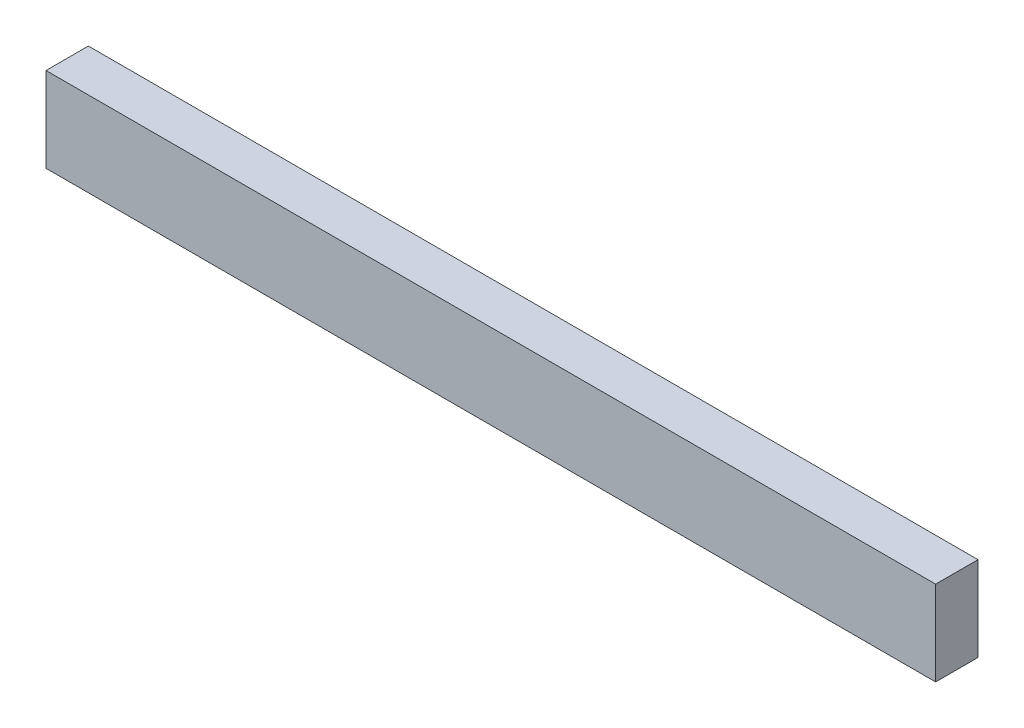
ISO-10303-21;
HEADER;
FILE_DESCRIPTION(('STEP AP214'),'2;1');
FILE_NAME('part.step','',(''),(''),'','','');
FILE_SCHEMA(('AUTOMOTIVE_DESIGN { 1 0 10303 214 1 1 1 1 }'));
ENDSEC;
DATA;
#1=APPLICATION_CONTEXT('core data for automotive mechanical design processes');
#2=APPLICATION_PROTOCOL_DEFINITION('international standard','automotive_design',2000,#1);
#3=PRODUCT_CONTEXT('',#1,'mechanical');
#4=PRODUCT('Part','Part','',(#3));
#5=PRODUCT_RELATED_PRODUCT_CATEGORY('part','',(#4));
#6=PRODUCT_DEFINITION_FORMATION('','',#4);
#7=PRODUCT_DEFINITION_CONTEXT('part definition',#1,'design');
#8=PRODUCT_DEFINITION('design','',#6,#7);
#9=PRODUCT_DEFINITION_SHAPE('','',#8);
#10=(LENGTH_UNIT() NAMED_UNIT(*) SI_UNIT(.MILLI.,.METRE.));
#11=(NAMED_UNIT(*) PLANE_ANGLE_UNIT() SI_UNIT($,.RADIAN.));
#12=(NAMED_UNIT(*) SI_UNIT($,.STERADIAN.) SOLID_ANGLE_UNIT());
#13=UNCERTAINTY_MEASURE_WITH_UNIT(LENGTH_MEASURE(1.E-05),#10,'distance_accuracy_value','');
#14=(GEOMETRIC_REPRESENTATION_CONTEXT(3) GLOBAL_UNCERTAINTY_ASSIGNED_CONTEXT((#13)) GLOBAL_UNIT_ASSIGNED_CONTEXT((#10,
#11,#12)) REPRESENTATION_CONTEXT('',''));
#15=CARTESIAN_POINT('',(0.,0.,0.));
#16=DIRECTION('',(0.,0.,1.));
#17=DIRECTION('',(1.,0.,0.));
#18=AXIS2_PLACEMENT_3D('',#15,#16,#17);
#19=CARTESIAN_POINT('',(105.,5.,2.5));
#20=DIRECTION('',(0.,0.,-1.));
#21=DIRECTION('',(0.,1.,0.));
#22=AXIS2_PLACEMENT_3D('',#19,#20,#21);
#23=PLANE('',#22);
#24=DIRECTION('',(0.,-1.,0.));
#25=VECTOR('',#24,1.);
#26=CARTESIAN_POINT('',(0.,5.,2.5));
#27=LINE('',#26,#25);
#28=CARTESIAN_POINT('',(0.,5.,2.5));
#29=VERTEX_POINT('',#28);
#30=CARTESIAN_POINT('',(0.,-5.,2.5));
#31=VERTEX_POINT('',#30);
#32=EDGE_CURVE('E111',#29,#31,#27,.T.);
#33=ORIENTED_EDGE('',*,*,#32,.T.);
#34=DIRECTION('',(-1.,0.,0.));
#35=VECTOR('',#34,1.);
#36=CARTESIAN_POINT('',(105.,-5.,2.5));
#37=LINE('',#36,#35);
#38=CARTESIAN_POINT('',(105.,-5.,2.5));
#39=VERTEX_POINT('',#38);
#40=EDGE_CURVE('E11',#39,#31,#37,.T.);
#41=ORIENTED_EDGE('',*,*,#40,.F.);
#42=DIRECTION('',(0.,-1.,0.));
#43=VECTOR('',#42,1.);
#44=CARTESIAN_POINT('',(105.,5.,2.5));
#45=LINE('',#44,#43);
#46=CARTESIAN_POINT('',(105.,5.,2.5));
#47=VERTEX_POINT('',#46);
#48=EDGE_CURVE('E95',#47,#39,#45,.T.);
#49=ORIENTED_EDGE('',*,*,#48,.F.);
#50=DIRECTION('',(-1.,0.,0.));
#51=VECTOR('',#50,1.);
#52=CARTESIAN_POINT('',(105.,5.,2.5));
#53=LINE('',#52,#51);
#54=EDGE_CURVE('E107',#47,#29,#53,.T.);
#55=ORIENTED_EDGE('',*,*,#54,.T.);
#56=EDGE_LOOP('',(#33,#41,#49,#55));
#57=FACE_BOUND('',#56,.T.);
#58=ADVANCED_FACE('F43',(#57),#23,.F.);
#59=CARTESIAN_POINT('',(105.,-5.,-2.5));
#60=DIRECTION('',(0.,1.,0.));
#61=DIRECTION('',(0.,0.,1.));
#62=AXIS2_PLACEMENT_3D('',#59,#60,#61);
#63=PLANE('',#62);
#64=DIRECTION('',(0.,0.,-1.));
#65=VECTOR('',#64,1.);
#66=CARTESIAN_POINT('',(0.,-5.,-2.5));
#67=LINE('',#66,#65);
#68=CARTESIAN_POINT('',(0.,-5.,-2.5));
#69=VERTEX_POINT('',#68);
#70=EDGE_CURVE('E100',#31,#69,#67,.T.);
#71=ORIENTED_EDGE('',*,*,#70,.T.);
#72=DIRECTION('',(-1.,0.,0.));
#73=VECTOR('',#72,1.);
#74=CARTESIAN_POINT('',(105.,-5.,-2.5));
#75=LINE('',#74,#73);
#76=CARTESIAN_POINT('',(105.,-5.,-2.5));
#77=VERTEX_POINT('',#76);
#78=EDGE_CURVE('E52',#77,#69,#75,.T.);
#79=ORIENTED_EDGE('',*,*,#78,.F.);
#80=DIRECTION('',(0.,0.,-1.));
#81=VECTOR('',#80,1.);
#82=CARTESIAN_POINT('',(105.,-5.,-2.5));
#83=LINE('',#82,#81);
#84=EDGE_CURVE('E90',#39,#77,#83,.T.);
#85=ORIENTED_EDGE('',*,*,#84,.F.);
#86=ORIENTED_EDGE('',*,*,#40,.T.);
#87=EDGE_LOOP('',(#71,#79,#85,#86));
#88=FACE_BOUND('',#87,.T.);
#89=ADVANCED_FACE('F99',(#88),#63,.F.);
#90=CARTESIAN_POINT('',(105.,5.,-2.5));
#91=DIRECTION('',(0.,0.,1.));
#92=DIRECTION('',(0.,-1.,0.));
#93=AXIS2_PLACEMENT_3D('',#90,#91,#92);
#94=PLANE('',#93);
#95=DIRECTION('',(0.,1.,0.));
#96=VECTOR('',#95,1.);
#97=CARTESIAN_POINT('',(0.,5.,-2.5));
#98=LINE('',#97,#96);
#99=CARTESIAN_POINT('',(0.,5.,-2.5));
#100=VERTEX_POINT('',#99);
#101=EDGE_CURVE('E77',#69,#100,#98,.T.);
#102=ORIENTED_EDGE('',*,*,#101,.T.);
#103=DIRECTION('',(-1.,0.,0.));
#104=VECTOR('',#103,1.);
#105=CARTESIAN_POINT('',(105.,5.,-2.5));
#106=LINE('',#105,#104);
#107=CARTESIAN_POINT('',(105.,5.,-2.5));
#108=VERTEX_POINT('',#107);
#109=EDGE_CURVE('E102',#108,#100,#106,.T.);
#110=ORIENTED_EDGE('',*,*,#109,.F.);
#111=DIRECTION('',(0.,1.,0.));
#112=VECTOR('',#111,1.);
#113=CARTESIAN_POINT('',(105.,5.,-2.5));
#114=LINE('',#113,#112);
#115=EDGE_CURVE('E93',#77,#108,#114,.T.);
#116=ORIENTED_EDGE('',*,*,#115,.F.);
#117=ORIENTED_EDGE('',*,*,#78,.T.);
#118=EDGE_LOOP('',(#102,#110,#116,#117));
#119=FACE_BOUND('',#118,.T.);
#120=ADVANCED_FACE('F103',(#119),#94,.F.);
#121=CARTESIAN_POINT('',(105.,5.,-2.5));
#122=DIRECTION('',(0.,-1.,0.));
#123=DIRECTION('',(0.,0.,-1.));
#124=AXIS2_PLACEMENT_3D('',#121,#122,#123);
#125=PLANE('',#124);
#126=DIRECTION('',(0.,0.,1.));
#127=VECTOR('',#126,1.);
#128=CARTESIAN_POINT('',(0.,5.,-2.5));
#129=LINE('',#128,#127);
#130=EDGE_CURVE('E83',#100,#29,#129,.T.);
#131=ORIENTED_EDGE('',*,*,#130,.T.);
#132=ORIENTED_EDGE('',*,*,#54,.F.);
#133=DIRECTION('',(0.,0.,1.));
#134=VECTOR('',#133,1.);
#135=CARTESIAN_POINT('',(105.,5.,-2.5));
#136=LINE('',#135,#134);
#137=EDGE_CURVE('E60',#108,#47,#136,.T.);
#138=ORIENTED_EDGE('',*,*,#137,.F.);
#139=ORIENTED_EDGE('',*,*,#109,.T.);
#140=EDGE_LOOP('',(#131,#132,#138,#139));
#141=FACE_BOUND('',#140,.T.);
#142=ADVANCED_FACE('F124',(#141),#125,.F.);
#143=CARTESIAN_POINT('',(105.,0.,0.));
#144=DIRECTION('',(-1.,0.,0.));
#145=DIRECTION('',(0.,0.,1.));
#146=AXIS2_PLACEMENT_3D('',#143,#144,#145);
#147=PLANE('',#146);
#148=ORIENTED_EDGE('',*,*,#48,.T.);
#149=ORIENTED_EDGE('',*,*,#84,.T.);
#150=ORIENTED_EDGE('',*,*,#115,.T.);
#151=ORIENTED_EDGE('',*,*,#137,.T.);
#152=EDGE_LOOP('',(#148,#149,#150,#151));
#153=FACE_BOUND('',#152,.T.);
#154=ADVANCED_FACE('F91',(#153),#147,.F.);
#155=CARTESIAN_POINT('',(0.,0.,0.));
#156=DIRECTION('',(-1.,0.,0.));
#157=DIRECTION('',(0.,0.,1.));
#158=AXIS2_PLACEMENT_3D('',#155,#156,#157);
#159=PLANE('',#158);
#160=ORIENTED_EDGE('',*,*,#32,.F.);
#161=ORIENTED_EDGE('',*,*,#130,.F.);
#162=ORIENTED_EDGE('',*,*,#101,.F.);
#163=ORIENTED_EDGE('',*,*,#70,.F.);
#164=EDGE_LOOP('',(#160,#161,#162,#163));
#165=FACE_BOUND('',#164,.T.);
#166=ADVANCED_FACE('F127',(#165),#159,.T.);
#167=CLOSED_SHELL('',(#58,#89,#120,#142,#154,#166));
#168=MANIFOLD_SOLID_BREP('B2',#167);
#169=ADVANCED_BREP_SHAPE_REPRESENTATION('',(#18,#168),#14);
#170=SHAPE_DEFINITION_REPRESENTATION(#9,#169);
ENDSEC;
END-ISO-10303-21;
